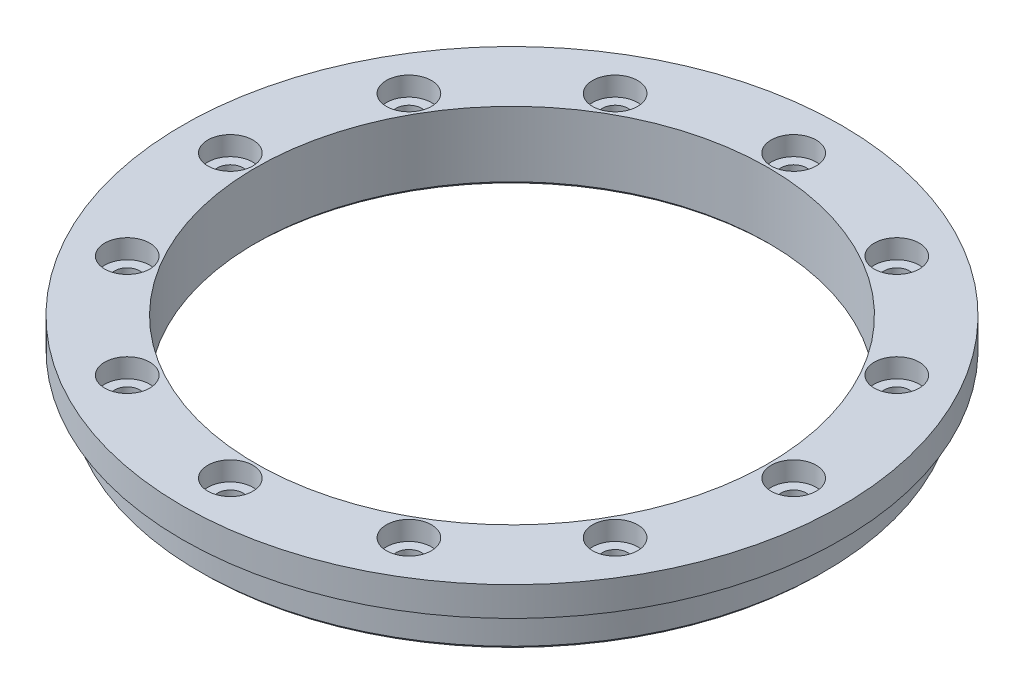
ISO-10303-21;
HEADER;
FILE_DESCRIPTION(('STEP AP214'),'2;1');
FILE_NAME('part.step','',(''),(''),'','','');
FILE_SCHEMA(('AUTOMOTIVE_DESIGN { 1 0 10303 214 1 1 1 1 }'));
ENDSEC;
DATA;
#1=APPLICATION_CONTEXT('core data for automotive mechanical design processes');
#2=APPLICATION_PROTOCOL_DEFINITION('international standard','automotive_design',2000,#1);
#3=PRODUCT_CONTEXT('',#1,'mechanical');
#4=PRODUCT('Part','Part','',(#3));
#5=PRODUCT_RELATED_PRODUCT_CATEGORY('part','',(#4));
#6=PRODUCT_DEFINITION_FORMATION('','',#4);
#7=PRODUCT_DEFINITION_CONTEXT('part definition',#1,'design');
#8=PRODUCT_DEFINITION('design','',#6,#7);
#9=PRODUCT_DEFINITION_SHAPE('','',#8);
#10=(LENGTH_UNIT() NAMED_UNIT(*) SI_UNIT(.MILLI.,.METRE.));
#11=(NAMED_UNIT(*) PLANE_ANGLE_UNIT() SI_UNIT($,.RADIAN.));
#12=(NAMED_UNIT(*) SI_UNIT($,.STERADIAN.) SOLID_ANGLE_UNIT());
#13=UNCERTAINTY_MEASURE_WITH_UNIT(LENGTH_MEASURE(1.E-05),#10,'distance_accuracy_value','');
#14=(GEOMETRIC_REPRESENTATION_CONTEXT(3) GLOBAL_UNCERTAINTY_ASSIGNED_CONTEXT((#13)) GLOBAL_UNIT_ASSIGNED_CONTEXT((#10,
#11,#12)) REPRESENTATION_CONTEXT('',''));
#15=CARTESIAN_POINT('',(0.,0.,0.));
#16=DIRECTION('',(0.,0.,1.));
#17=DIRECTION('',(1.,0.,0.));
#18=AXIS2_PLACEMENT_3D('',#15,#16,#17);
#19=CARTESIAN_POINT('',(0.,0.,0.));
#20=DIRECTION('',(0.,-1.,0.));
#21=DIRECTION('',(0.,0.,-1.));
#22=AXIS2_PLACEMENT_3D('',#19,#20,#21);
#23=CYLINDRICAL_SURFACE('',#22,55.5);
#24=CARTESIAN_POINT('',(0.,91.9,0.));
#25=DIRECTION('',(0.,-1.,0.));
#26=DIRECTION('',(0.,0.,-1.));
#27=AXIS2_PLACEMENT_3D('',#24,#25,#26);
#28=CIRCLE('',#27,55.5);
#29=CARTESIAN_POINT('',(0.,91.9,-55.5));
#30=VERTEX_POINT('',#29);
#31=EDGE_CURVE('E13',#30,#30,#28,.F.);
#32=ORIENTED_EDGE('',*,*,#31,.T.);
#33=EDGE_LOOP('',(#32));
#34=FACE_BOUND('',#33,.T.);
#35=CARTESIAN_POINT('',(0.,97.3,0.));
#36=DIRECTION('',(0.,1.,0.));
#37=DIRECTION('',(0.,0.,1.));
#38=AXIS2_PLACEMENT_3D('',#35,#36,#37);
#39=CIRCLE('',#38,55.5);
#40=CARTESIAN_POINT('',(0.,97.3,55.5));
#41=VERTEX_POINT('',#40);
#42=EDGE_CURVE('E282',#41,#41,#39,.T.);
#43=ORIENTED_EDGE('',*,*,#42,.F.);
#44=EDGE_LOOP('',(#43));
#45=FACE_BOUND('',#44,.T.);
#46=ADVANCED_FACE('F57',(#34,#45),#23,.T.);
#47=CARTESIAN_POINT('',(0.,91.3,-45.5));
#48=DIRECTION('',(0.,-1.,0.));
#49=DIRECTION('',(0.,0.,-1.));
#50=AXIS2_PLACEMENT_3D('',#47,#48,#49);
#51=PLANE('',#50);
#52=CARTESIAN_POINT('',(0.,91.3,0.));
#53=DIRECTION('',(0.,-1.,0.));
#54=DIRECTION('',(0.,0.,-1.));
#55=AXIS2_PLACEMENT_3D('',#52,#53,#54);
#56=CIRCLE('',#55,54.9);
#57=CARTESIAN_POINT('',(0.,91.3,-54.9));
#58=VERTEX_POINT('',#57);
#59=EDGE_CURVE('E66',#58,#58,#56,.T.);
#60=ORIENTED_EDGE('',*,*,#59,.T.);
#61=EDGE_LOOP('',(#60));
#62=FACE_BOUND('',#61,.T.);
#63=CARTESIAN_POINT('',(0.,91.3,0.));
#64=DIRECTION('',(0.,-1.,0.));
#65=DIRECTION('',(0.,0.,-1.));
#66=AXIS2_PLACEMENT_3D('',#63,#64,#65);
#67=CIRCLE('',#66,46.1);
#68=CARTESIAN_POINT('',(0.,91.3,-46.1));
#69=VERTEX_POINT('',#68);
#70=EDGE_CURVE('E72',#69,#69,#67,.F.);
#71=ORIENTED_EDGE('',*,*,#70,.T.);
#72=EDGE_LOOP('',(#71));
#73=FACE_BOUND('',#72,.T.);
#74=CARTESIAN_POINT('',(25.0000000000013,91.3,-43.3012701892212));
#75=DIRECTION('',(0.,-1.,0.));
#76=DIRECTION('',(0.,0.,-1.));
#77=AXIS2_PLACEMENT_3D('',#74,#75,#76);
#78=CIRCLE('',#77,2.25);
#79=CARTESIAN_POINT('',(25.0000000000013,91.3,-45.5512701892212));
#80=VERTEX_POINT('',#79);
#81=EDGE_CURVE('E151',#80,#80,#78,.F.);
#82=ORIENTED_EDGE('',*,*,#81,.T.);
#83=EDGE_LOOP('',(#82));
#84=FACE_BOUND('',#83,.T.);
#85=CARTESIAN_POINT('',(43.3012701892234,91.3,-24.9999999999974));
#86=DIRECTION('',(0.,-1.,0.));
#87=DIRECTION('',(0.,0.,-1.));
#88=AXIS2_PLACEMENT_3D('',#85,#86,#87);
#89=CIRCLE('',#88,2.25);
#90=CARTESIAN_POINT('',(43.3012701892234,91.3,-27.2499999999974));
#91=VERTEX_POINT('',#90);
#92=EDGE_CURVE('E145',#91,#91,#89,.F.);
#93=ORIENTED_EDGE('',*,*,#92,.T.);
#94=EDGE_LOOP('',(#93));
#95=FACE_BOUND('',#94,.T.);
#96=CARTESIAN_POINT('',(43.301270189219,91.3,25.0000000000052));
#97=DIRECTION('',(0.,-1.,0.));
#98=DIRECTION('',(0.,0.,-1.));
#99=AXIS2_PLACEMENT_3D('',#96,#97,#98);
#100=CIRCLE('',#99,2.25);
#101=CARTESIAN_POINT('',(43.301270189219,91.3,22.7500000000052));
#102=VERTEX_POINT('',#101);
#103=EDGE_CURVE('E139',#102,#102,#100,.F.);
#104=ORIENTED_EDGE('',*,*,#103,.T.);
#105=EDGE_LOOP('',(#104));
#106=FACE_BOUND('',#105,.T.);
#107=CARTESIAN_POINT('',(24.9999999999936,91.3,43.3012701892257));
#108=DIRECTION('',(0.,-1.,0.));
#109=DIRECTION('',(0.,0.,-1.));
#110=AXIS2_PLACEMENT_3D('',#107,#108,#109);
#111=CIRCLE('',#110,2.25);
#112=CARTESIAN_POINT('',(24.9999999999936,91.3,41.0512701892257));
#113=VERTEX_POINT('',#112);
#114=EDGE_CURVE('E133',#113,#113,#111,.F.);
#115=ORIENTED_EDGE('',*,*,#114,.T.);
#116=EDGE_LOOP('',(#115));
#117=FACE_BOUND('',#116,.T.);
#118=CARTESIAN_POINT('',(-8.94227434448302E-12,91.3,50.));
#119=DIRECTION('',(0.,-1.,0.));
#120=DIRECTION('',(0.,0.,-1.));
#121=AXIS2_PLACEMENT_3D('',#118,#119,#120);
#122=CIRCLE('',#121,2.25);
#123=CARTESIAN_POINT('',(-8.94227434448302E-12,91.3,47.75));
#124=VERTEX_POINT('',#123);
#125=EDGE_CURVE('E127',#124,#124,#122,.F.);
#126=ORIENTED_EDGE('',*,*,#125,.T.);
#127=EDGE_LOOP('',(#126));
#128=FACE_BOUND('',#127,.T.);
#129=CARTESIAN_POINT('',(-25.000000000009,91.3,43.3012701892167));
#130=DIRECTION('',(0.,-1.,0.));
#131=DIRECTION('',(0.,0.,-1.));
#132=AXIS2_PLACEMENT_3D('',#129,#130,#131);
#133=CIRCLE('',#132,2.25);
#134=CARTESIAN_POINT('',(-25.000000000009,91.3,41.0512701892167));
#135=VERTEX_POINT('',#134);
#136=EDGE_CURVE('E121',#135,#135,#133,.F.);
#137=ORIENTED_EDGE('',*,*,#136,.T.);
#138=EDGE_LOOP('',(#137));
#139=FACE_BOUND('',#138,.T.);
#140=CARTESIAN_POINT('',(-50.,91.3,-1.34023092864783E-11));
#141=DIRECTION('',(0.,-1.,0.));
#142=DIRECTION('',(0.,0.,-1.));
#143=AXIS2_PLACEMENT_3D('',#140,#141,#142);
#144=CIRCLE('',#143,2.25);
#145=CARTESIAN_POINT('',(-50.,91.3,-2.2500000000134));
#146=VERTEX_POINT('',#145);
#147=EDGE_CURVE('E115',#146,#146,#144,.F.);
#148=ORIENTED_EDGE('',*,*,#147,.T.);
#149=EDGE_LOOP('',(#148));
#150=FACE_BOUND('',#149,.T.);
#151=CARTESIAN_POINT('',(-24.9999999999858,91.3,-43.3012701892301));
#152=DIRECTION('',(0.,-1.,0.));
#153=DIRECTION('',(0.,0.,-1.));
#154=AXIS2_PLACEMENT_3D('',#151,#152,#153);
#155=CIRCLE('',#154,2.25);
#156=CARTESIAN_POINT('',(-24.9999999999858,91.3,-45.5512701892301));
#157=VERTEX_POINT('',#156);
#158=EDGE_CURVE('E109',#157,#157,#155,.F.);
#159=ORIENTED_EDGE('',*,*,#158,.T.);
#160=EDGE_LOOP('',(#159));
#161=FACE_BOUND('',#160,.T.);
#162=CARTESIAN_POINT('',(-43.3012701892145,91.3,-25.0000000000129));
#163=DIRECTION('',(0.,-1.,0.));
#164=DIRECTION('',(0.,0.,-1.));
#165=AXIS2_PLACEMENT_3D('',#162,#163,#164);
#166=CIRCLE('',#165,2.25);
#167=CARTESIAN_POINT('',(-43.3012701892145,91.3,-27.2500000000129));
#168=VERTEX_POINT('',#167);
#169=EDGE_CURVE('E103',#168,#168,#166,.F.);
#170=ORIENTED_EDGE('',*,*,#169,.T.);
#171=EDGE_LOOP('',(#170));
#172=FACE_BOUND('',#171,.T.);
#173=CARTESIAN_POINT('',(-43.3012701892279,91.3,24.9999999999897));
#174=DIRECTION('',(0.,-1.,0.));
#175=DIRECTION('',(0.,0.,-1.));
#176=AXIS2_PLACEMENT_3D('',#173,#174,#175);
#177=CIRCLE('',#176,2.25);
#178=CARTESIAN_POINT('',(-43.3012701892279,91.3,22.7499999999897));
#179=VERTEX_POINT('',#178);
#180=EDGE_CURVE('E97',#179,#179,#177,.F.);
#181=ORIENTED_EDGE('',*,*,#180,.T.);
#182=EDGE_LOOP('',(#181));
#183=FACE_BOUND('',#182,.T.);
#184=CARTESIAN_POINT('',(50.,91.3,4.47113717224151E-12));
#185=DIRECTION('',(0.,-1.,0.));
#186=DIRECTION('',(0.,0.,-1.));
#187=AXIS2_PLACEMENT_3D('',#184,#185,#186);
#188=CIRCLE('',#187,2.25);
#189=CARTESIAN_POINT('',(50.,91.3,-2.24999999999553));
#190=VERTEX_POINT('',#189);
#191=EDGE_CURVE('E91',#190,#190,#188,.F.);
#192=ORIENTED_EDGE('',*,*,#191,.T.);
#193=EDGE_LOOP('',(#192));
#194=FACE_BOUND('',#193,.T.);
#195=CARTESIAN_POINT('',(0.,91.3,-50.));
#196=DIRECTION('',(0.,-1.,0.));
#197=DIRECTION('',(0.,0.,-1.));
#198=AXIS2_PLACEMENT_3D('',#195,#196,#197);
#199=CIRCLE('',#198,2.25);
#200=CARTESIAN_POINT('',(0.,91.3,-52.25));
#201=VERTEX_POINT('',#200);
#202=EDGE_CURVE('E85',#201,#201,#199,.F.);
#203=ORIENTED_EDGE('',*,*,#202,.T.);
#204=EDGE_LOOP('',(#203));
#205=FACE_BOUND('',#204,.T.);
#206=ADVANCED_FACE('F319',(#62,#73,#84,#95,#106,#117,#128,#139,#150,#161,#172,#183,#194,#205),
#51,.T.);
#207=CARTESIAN_POINT('',(0.,0.,0.));
#208=DIRECTION('',(0.,-1.,0.));
#209=DIRECTION('',(0.,0.,-1.));
#210=AXIS2_PLACEMENT_3D('',#207,#208,#209);
#211=CYLINDRICAL_SURFACE('',#210,45.5);
#212=CARTESIAN_POINT('',(0.,91.9,0.));
#213=DIRECTION('',(0.,-1.,0.));
#214=DIRECTION('',(0.,0.,-1.));
#215=AXIS2_PLACEMENT_3D('',#212,#213,#214);
#216=CIRCLE('',#215,45.5);
#217=CARTESIAN_POINT('',(0.,91.9,-45.5));
#218=VERTEX_POINT('',#217);
#219=EDGE_CURVE('E78',#218,#218,#216,.T.);
#220=ORIENTED_EDGE('',*,*,#219,.T.);
#221=EDGE_LOOP('',(#220));
#222=FACE_BOUND('',#221,.T.);
#223=CARTESIAN_POINT('',(0.,103.5,0.));
#224=DIRECTION('',(0.,-1.,0.));
#225=DIRECTION('',(0.,0.,-1.));
#226=AXIS2_PLACEMENT_3D('',#223,#224,#225);
#227=CIRCLE('',#226,45.5);
#228=CARTESIAN_POINT('',(0.,103.5,-45.5));
#229=VERTEX_POINT('',#228);
#230=EDGE_CURVE('E164',#229,#229,#227,.T.);
#231=ORIENTED_EDGE('',*,*,#230,.F.);
#232=EDGE_LOOP('',(#231));
#233=FACE_BOUND('',#232,.T.);
#234=ADVANCED_FACE('F327',(#222,#233),#211,.F.);
#235=CARTESIAN_POINT('',(0.,98.3,-55.5));
#236=DIRECTION('',(0.,-1.,0.));
#237=DIRECTION('',(0.,0.,-1.));
#238=AXIS2_PLACEMENT_3D('',#235,#236,#237);
#239=PLANE('',#238);
#240=CARTESIAN_POINT('',(0.,98.3,0.));
#241=DIRECTION('',(0.,-1.,0.));
#242=DIRECTION('',(0.,0.,-1.));
#243=AXIS2_PLACEMENT_3D('',#240,#241,#242);
#244=CIRCLE('',#243,58.5);
#245=CARTESIAN_POINT('',(0.,98.3,-58.5));
#246=VERTEX_POINT('',#245);
#247=EDGE_CURVE('E84',#246,#246,#244,.T.);
#248=ORIENTED_EDGE('',*,*,#247,.T.);
#249=EDGE_LOOP('',(#248));
#250=FACE_BOUND('',#249,.T.);
#251=CARTESIAN_POINT('',(0.,98.3,0.));
#252=DIRECTION('',(0.,1.,0.));
#253=DIRECTION('',(0.,0.,1.));
#254=AXIS2_PLACEMENT_3D('',#251,#252,#253);
#255=CIRCLE('',#254,54.5);
#256=CARTESIAN_POINT('',(0.,98.3,54.5));
#257=VERTEX_POINT('',#256);
#258=EDGE_CURVE('E296',#257,#257,#255,.T.);
#259=ORIENTED_EDGE('',*,*,#258,.T.);
#260=EDGE_LOOP('',(#259));
#261=FACE_BOUND('',#260,.T.);
#262=ADVANCED_FACE('F302',(#250,#261),#239,.T.);
#263=CARTESIAN_POINT('',(0.,0.,0.));
#264=DIRECTION('',(0.,-1.,0.));
#265=DIRECTION('',(0.,0.,-1.));
#266=AXIS2_PLACEMENT_3D('',#263,#264,#265);
#267=CYLINDRICAL_SURFACE('',#266,58.5);
#268=CARTESIAN_POINT('',(0.,103.5,0.));
#269=DIRECTION('',(0.,-1.,0.));
#270=DIRECTION('',(0.,0.,-1.));
#271=AXIS2_PLACEMENT_3D('',#268,#269,#270);
#272=CIRCLE('',#271,58.5);
#273=CARTESIAN_POINT('',(0.,103.5,-58.5));
#274=VERTEX_POINT('',#273);
#275=EDGE_CURVE('E160',#274,#274,#272,.T.);
#276=ORIENTED_EDGE('',*,*,#275,.T.);
#277=EDGE_LOOP('',(#276));
#278=FACE_BOUND('',#277,.T.);
#279=ORIENTED_EDGE('',*,*,#247,.F.);
#280=EDGE_LOOP('',(#279));
#281=FACE_BOUND('',#280,.T.);
#282=ADVANCED_FACE('F343',(#278,#281),#267,.T.);
#283=CARTESIAN_POINT('',(0.,103.5,-58.5));
#284=DIRECTION('',(0.,1.,0.));
#285=DIRECTION('',(0.,0.,1.));
#286=AXIS2_PLACEMENT_3D('',#283,#284,#285);
#287=PLANE('',#286);
#288=CARTESIAN_POINT('',(0.,103.5,-50.));
#289=DIRECTION('',(0.,1.,0.));
#290=DIRECTION('',(0.,0.,1.));
#291=AXIS2_PLACEMENT_3D('',#288,#289,#290);
#292=CIRCLE('',#291,4.);
#293=CARTESIAN_POINT('',(0.,103.5,-46.));
#294=VERTEX_POINT('',#293);
#295=EDGE_CURVE('E90',#294,#294,#292,.T.);
#296=ORIENTED_EDGE('',*,*,#295,.F.);
#297=EDGE_LOOP('',(#296));
#298=FACE_BOUND('',#297,.T.);
#299=CARTESIAN_POINT('',(25.0000000000013,103.5,-43.3012701892212));
#300=DIRECTION('',(0.,1.,0.));
#301=DIRECTION('',(0.,0.,1.));
#302=AXIS2_PLACEMENT_3D('',#299,#300,#301);
#303=CIRCLE('',#302,4.);
#304=CARTESIAN_POINT('',(25.0000000000013,103.5,-39.3012701892212));
#305=VERTEX_POINT('',#304);
#306=EDGE_CURVE('E156',#305,#305,#303,.T.);
#307=ORIENTED_EDGE('',*,*,#306,.F.);
#308=EDGE_LOOP('',(#307));
#309=FACE_BOUND('',#308,.T.);
#310=CARTESIAN_POINT('',(43.3012701892234,103.5,-24.9999999999974));
#311=DIRECTION('',(0.,1.,0.));
#312=DIRECTION('',(0.,0.,1.));
#313=AXIS2_PLACEMENT_3D('',#310,#311,#312);
#314=CIRCLE('',#313,4.);
#315=CARTESIAN_POINT('',(43.3012701892234,103.5,-20.9999999999974));
#316=VERTEX_POINT('',#315);
#317=EDGE_CURVE('E150',#316,#316,#314,.T.);
#318=ORIENTED_EDGE('',*,*,#317,.F.);
#319=EDGE_LOOP('',(#318));
#320=FACE_BOUND('',#319,.T.);
#321=CARTESIAN_POINT('',(50.,103.5,4.47113717224151E-12));
#322=DIRECTION('',(0.,1.,0.));
#323=DIRECTION('',(0.,0.,1.));
#324=AXIS2_PLACEMENT_3D('',#321,#322,#323);
#325=CIRCLE('',#324,4.);
#326=CARTESIAN_POINT('',(50.,103.5,4.00000000000447));
#327=VERTEX_POINT('',#326);
#328=EDGE_CURVE('E96',#327,#327,#325,.T.);
#329=ORIENTED_EDGE('',*,*,#328,.F.);
#330=EDGE_LOOP('',(#329));
#331=FACE_BOUND('',#330,.T.);
#332=CARTESIAN_POINT('',(43.301270189219,103.5,25.0000000000052));
#333=DIRECTION('',(0.,1.,0.));
#334=DIRECTION('',(0.,0.,1.));
#335=AXIS2_PLACEMENT_3D('',#332,#333,#334);
#336=CIRCLE('',#335,4.);
#337=CARTESIAN_POINT('',(43.301270189219,103.5,29.0000000000052));
#338=VERTEX_POINT('',#337);
#339=EDGE_CURVE('E144',#338,#338,#336,.T.);
#340=ORIENTED_EDGE('',*,*,#339,.F.);
#341=EDGE_LOOP('',(#340));
#342=FACE_BOUND('',#341,.T.);
#343=CARTESIAN_POINT('',(24.9999999999936,103.5,43.3012701892257));
#344=DIRECTION('',(0.,1.,0.));
#345=DIRECTION('',(0.,0.,1.));
#346=AXIS2_PLACEMENT_3D('',#343,#344,#345);
#347=CIRCLE('',#346,4.);
#348=CARTESIAN_POINT('',(24.9999999999936,103.5,47.3012701892257));
#349=VERTEX_POINT('',#348);
#350=EDGE_CURVE('E138',#349,#349,#347,.T.);
#351=ORIENTED_EDGE('',*,*,#350,.F.);
#352=EDGE_LOOP('',(#351));
#353=FACE_BOUND('',#352,.T.);
#354=CARTESIAN_POINT('',(-8.94227434448302E-12,103.5,50.));
#355=DIRECTION('',(0.,1.,0.));
#356=DIRECTION('',(0.,0.,1.));
#357=AXIS2_PLACEMENT_3D('',#354,#355,#356);
#358=CIRCLE('',#357,4.);
#359=CARTESIAN_POINT('',(-8.94227434448302E-12,103.5,54.));
#360=VERTEX_POINT('',#359);
#361=EDGE_CURVE('E132',#360,#360,#358,.T.);
#362=ORIENTED_EDGE('',*,*,#361,.F.);
#363=EDGE_LOOP('',(#362));
#364=FACE_BOUND('',#363,.T.);
#365=CARTESIAN_POINT('',(-25.000000000009,103.5,43.3012701892167));
#366=DIRECTION('',(0.,1.,0.));
#367=DIRECTION('',(0.,0.,1.));
#368=AXIS2_PLACEMENT_3D('',#365,#366,#367);
#369=CIRCLE('',#368,4.);
#370=CARTESIAN_POINT('',(-25.000000000009,103.5,47.3012701892167));
#371=VERTEX_POINT('',#370);
#372=EDGE_CURVE('E126',#371,#371,#369,.T.);
#373=ORIENTED_EDGE('',*,*,#372,.F.);
#374=EDGE_LOOP('',(#373));
#375=FACE_BOUND('',#374,.T.);
#376=CARTESIAN_POINT('',(-43.3012701892279,103.5,24.9999999999897));
#377=DIRECTION('',(0.,1.,0.));
#378=DIRECTION('',(0.,0.,1.));
#379=AXIS2_PLACEMENT_3D('',#376,#377,#378);
#380=CIRCLE('',#379,4.);
#381=CARTESIAN_POINT('',(-43.3012701892279,103.5,28.9999999999897));
#382=VERTEX_POINT('',#381);
#383=EDGE_CURVE('E102',#382,#382,#380,.T.);
#384=ORIENTED_EDGE('',*,*,#383,.F.);
#385=EDGE_LOOP('',(#384));
#386=FACE_BOUND('',#385,.T.);
#387=CARTESIAN_POINT('',(-50.,103.5,-1.34023092864783E-11));
#388=DIRECTION('',(0.,1.,0.));
#389=DIRECTION('',(0.,0.,1.));
#390=AXIS2_PLACEMENT_3D('',#387,#388,#389);
#391=CIRCLE('',#390,4.);
#392=CARTESIAN_POINT('',(-50.,103.5,3.9999999999866));
#393=VERTEX_POINT('',#392);
#394=EDGE_CURVE('E120',#393,#393,#391,.T.);
#395=ORIENTED_EDGE('',*,*,#394,.F.);
#396=EDGE_LOOP('',(#395));
#397=FACE_BOUND('',#396,.T.);
#398=CARTESIAN_POINT('',(-43.3012701892145,103.5,-25.0000000000129));
#399=DIRECTION('',(0.,1.,0.));
#400=DIRECTION('',(0.,0.,1.));
#401=AXIS2_PLACEMENT_3D('',#398,#399,#400);
#402=CIRCLE('',#401,4.);
#403=CARTESIAN_POINT('',(-43.3012701892145,103.5,-21.0000000000129));
#404=VERTEX_POINT('',#403);
#405=EDGE_CURVE('E108',#404,#404,#402,.T.);
#406=ORIENTED_EDGE('',*,*,#405,.F.);
#407=EDGE_LOOP('',(#406));
#408=FACE_BOUND('',#407,.T.);
#409=CARTESIAN_POINT('',(-24.9999999999858,103.5,-43.3012701892301));
#410=DIRECTION('',(0.,1.,0.));
#411=DIRECTION('',(0.,0.,1.));
#412=AXIS2_PLACEMENT_3D('',#409,#410,#411);
#413=CIRCLE('',#412,4.);
#414=CARTESIAN_POINT('',(-24.9999999999858,103.5,-39.3012701892301));
#415=VERTEX_POINT('',#414);
#416=EDGE_CURVE('E114',#415,#415,#413,.T.);
#417=ORIENTED_EDGE('',*,*,#416,.F.);
#418=EDGE_LOOP('',(#417));
#419=FACE_BOUND('',#418,.T.);
#420=ORIENTED_EDGE('',*,*,#230,.T.);
#421=EDGE_LOOP('',(#420));
#422=FACE_BOUND('',#421,.T.);
#423=ORIENTED_EDGE('',*,*,#275,.F.);
#424=EDGE_LOOP('',(#423));
#425=FACE_BOUND('',#424,.T.);
#426=ADVANCED_FACE('F349',(#298,#309,#320,#331,#342,#353,#364,#375,#386,#397,#408,#419,#422,
#425),#287,.T.);
#427=CARTESIAN_POINT('',(-24.9999999999858,103.5,-43.3012701892301));
#428=DIRECTION('',(0.,1.,0.));
#429=DIRECTION('',(0.,0.,1.));
#430=AXIS2_PLACEMENT_3D('',#427,#428,#429);
#431=CYLINDRICAL_SURFACE('',#430,2.25);
#432=ORIENTED_EDGE('',*,*,#158,.F.);
#433=EDGE_LOOP('',(#432));
#434=FACE_BOUND('',#433,.T.);
#435=CARTESIAN_POINT('',(-24.9999999999858,100.1,-43.3012701892301));
#436=DIRECTION('',(0.,1.,0.));
#437=DIRECTION('',(0.,0.,1.));
#438=AXIS2_PLACEMENT_3D('',#435,#436,#437);
#439=CIRCLE('',#438,2.25);
#440=CARTESIAN_POINT('',(-24.9999999999858,100.1,-41.0512701892301));
#441=VERTEX_POINT('',#440);
#442=EDGE_CURVE('E113',#441,#441,#439,.T.);
#443=ORIENTED_EDGE('',*,*,#442,.T.);
#444=EDGE_LOOP('',(#443));
#445=FACE_BOUND('',#444,.T.);
#446=ADVANCED_FACE('F352',(#434,#445),#431,.F.);
#447=CARTESIAN_POINT('',(-22.7499999999858,100.1,-43.3012701892301));
#448=DIRECTION('',(0.,-1.,0.));
#449=DIRECTION('',(0.,0.,-1.));
#450=AXIS2_PLACEMENT_3D('',#447,#448,#449);
#451=PLANE('',#450);
#452=ORIENTED_EDGE('',*,*,#442,.F.);
#453=EDGE_LOOP('',(#452));
#454=FACE_BOUND('',#453,.T.);
#455=CARTESIAN_POINT('',(-24.9999999999858,100.1,-43.3012701892301));
#456=DIRECTION('',(0.,1.,0.));
#457=DIRECTION('',(0.,0.,1.));
#458=AXIS2_PLACEMENT_3D('',#455,#456,#457);
#459=CIRCLE('',#458,4.);
#460=CARTESIAN_POINT('',(-24.9999999999858,100.1,-39.3012701892301));
#461=VERTEX_POINT('',#460);
#462=EDGE_CURVE('E168',#461,#461,#459,.T.);
#463=ORIENTED_EDGE('',*,*,#462,.T.);
#464=EDGE_LOOP('',(#463));
#465=FACE_BOUND('',#464,.T.);
#466=ADVANCED_FACE('F367',(#454,#465),#451,.F.);
#467=CARTESIAN_POINT('',(-24.9999999999858,103.5,-43.3012701892301));
#468=DIRECTION('',(0.,1.,0.));
#469=DIRECTION('',(0.,0.,1.));
#470=AXIS2_PLACEMENT_3D('',#467,#468,#469);
#471=CYLINDRICAL_SURFACE('',#470,4.);
#472=ORIENTED_EDGE('',*,*,#462,.F.);
#473=EDGE_LOOP('',(#472));
#474=FACE_BOUND('',#473,.T.);
#475=ORIENTED_EDGE('',*,*,#416,.T.);
#476=EDGE_LOOP('',(#475));
#477=FACE_BOUND('',#476,.T.);
#478=ADVANCED_FACE('F364',(#474,#477),#471,.F.);
#479=CARTESIAN_POINT('',(-43.3012701892145,103.5,-25.0000000000129));
#480=DIRECTION('',(0.,1.,0.));
#481=DIRECTION('',(0.,0.,1.));
#482=AXIS2_PLACEMENT_3D('',#479,#480,#481);
#483=CYLINDRICAL_SURFACE('',#482,2.25);
#484=ORIENTED_EDGE('',*,*,#169,.F.);
#485=EDGE_LOOP('',(#484));
#486=FACE_BOUND('',#485,.T.);
#487=CARTESIAN_POINT('',(-43.3012701892145,100.1,-25.0000000000129));
#488=DIRECTION('',(0.,1.,0.));
#489=DIRECTION('',(0.,0.,1.));
#490=AXIS2_PLACEMENT_3D('',#487,#488,#489);
#491=CIRCLE('',#490,2.25);
#492=CARTESIAN_POINT('',(-43.3012701892145,100.1,-22.7500000000129));
#493=VERTEX_POINT('',#492);
#494=EDGE_CURVE('E107',#493,#493,#491,.T.);
#495=ORIENTED_EDGE('',*,*,#494,.T.);
#496=EDGE_LOOP('',(#495));
#497=FACE_BOUND('',#496,.T.);
#498=ADVANCED_FACE('F366',(#486,#497),#483,.F.);
#499=CARTESIAN_POINT('',(-41.0512701892145,100.1,-25.0000000000129));
#500=DIRECTION('',(0.,-1.,0.));
#501=DIRECTION('',(0.,0.,-1.));
#502=AXIS2_PLACEMENT_3D('',#499,#500,#501);
#503=PLANE('',#502);
#504=ORIENTED_EDGE('',*,*,#494,.F.);
#505=EDGE_LOOP('',(#504));
#506=FACE_BOUND('',#505,.T.);
#507=CARTESIAN_POINT('',(-43.3012701892145,100.1,-25.0000000000129));
#508=DIRECTION('',(0.,1.,0.));
#509=DIRECTION('',(0.,0.,1.));
#510=AXIS2_PLACEMENT_3D('',#507,#508,#509);
#511=CIRCLE('',#510,4.);
#512=CARTESIAN_POINT('',(-43.3012701892145,100.1,-21.0000000000129));
#513=VERTEX_POINT('',#512);
#514=EDGE_CURVE('E172',#513,#513,#511,.T.);
#515=ORIENTED_EDGE('',*,*,#514,.T.);
#516=EDGE_LOOP('',(#515));
#517=FACE_BOUND('',#516,.T.);
#518=ADVANCED_FACE('F379',(#506,#517),#503,.F.);
#519=CARTESIAN_POINT('',(-43.3012701892145,103.5,-25.0000000000129));
#520=DIRECTION('',(0.,1.,0.));
#521=DIRECTION('',(0.,0.,1.));
#522=AXIS2_PLACEMENT_3D('',#519,#520,#521);
#523=CYLINDRICAL_SURFACE('',#522,4.);
#524=ORIENTED_EDGE('',*,*,#514,.F.);
#525=EDGE_LOOP('',(#524));
#526=FACE_BOUND('',#525,.T.);
#527=ORIENTED_EDGE('',*,*,#405,.T.);
#528=EDGE_LOOP('',(#527));
#529=FACE_BOUND('',#528,.T.);
#530=ADVANCED_FACE('F375',(#526,#529),#523,.F.);
#531=CARTESIAN_POINT('',(-50.,103.5,-1.34023092864783E-11));
#532=DIRECTION('',(0.,1.,0.));
#533=DIRECTION('',(0.,0.,1.));
#534=AXIS2_PLACEMENT_3D('',#531,#532,#533);
#535=CYLINDRICAL_SURFACE('',#534,2.25);
#536=ORIENTED_EDGE('',*,*,#147,.F.);
#537=EDGE_LOOP('',(#536));
#538=FACE_BOUND('',#537,.T.);
#539=CARTESIAN_POINT('',(-50.,100.1,-1.34023092864783E-11));
#540=DIRECTION('',(0.,1.,0.));
#541=DIRECTION('',(0.,0.,1.));
#542=AXIS2_PLACEMENT_3D('',#539,#540,#541);
#543=CIRCLE('',#542,2.25);
#544=CARTESIAN_POINT('',(-50.,100.1,2.2499999999866));
#545=VERTEX_POINT('',#544);
#546=EDGE_CURVE('E119',#545,#545,#543,.T.);
#547=ORIENTED_EDGE('',*,*,#546,.T.);
#548=EDGE_LOOP('',(#547));
#549=FACE_BOUND('',#548,.T.);
#550=ADVANCED_FACE('F378',(#538,#549),#535,.F.);
#551=CARTESIAN_POINT('',(-47.75,100.1,-1.34023092864783E-11));
#552=DIRECTION('',(0.,-1.,0.));
#553=DIRECTION('',(0.,0.,-1.));
#554=AXIS2_PLACEMENT_3D('',#551,#552,#553);
#555=PLANE('',#554);
#556=ORIENTED_EDGE('',*,*,#546,.F.);
#557=EDGE_LOOP('',(#556));
#558=FACE_BOUND('',#557,.T.);
#559=CARTESIAN_POINT('',(-50.,100.1,-1.34023092864783E-11));
#560=DIRECTION('',(0.,1.,0.));
#561=DIRECTION('',(0.,0.,1.));
#562=AXIS2_PLACEMENT_3D('',#559,#560,#561);
#563=CIRCLE('',#562,4.);
#564=CARTESIAN_POINT('',(-50.,100.1,3.99999999998659));
#565=VERTEX_POINT('',#564);
#566=EDGE_CURVE('E182',#565,#565,#563,.T.);
#567=ORIENTED_EDGE('',*,*,#566,.T.);
#568=EDGE_LOOP('',(#567));
#569=FACE_BOUND('',#568,.T.);
#570=ADVANCED_FACE('F391',(#558,#569),#555,.F.);
#571=CARTESIAN_POINT('',(-50.,103.5,-1.34023092864783E-11));
#572=DIRECTION('',(0.,1.,0.));
#573=DIRECTION('',(0.,0.,1.));
#574=AXIS2_PLACEMENT_3D('',#571,#572,#573);
#575=CYLINDRICAL_SURFACE('',#574,4.);
#576=ORIENTED_EDGE('',*,*,#566,.F.);
#577=EDGE_LOOP('',(#576));
#578=FACE_BOUND('',#577,.T.);
#579=ORIENTED_EDGE('',*,*,#394,.T.);
#580=EDGE_LOOP('',(#579));
#581=FACE_BOUND('',#580,.T.);
#582=ADVANCED_FACE('F387',(#578,#581),#575,.F.);
#583=CARTESIAN_POINT('',(-43.3012701892279,103.5,24.9999999999897));
#584=DIRECTION('',(0.,1.,0.));
#585=DIRECTION('',(0.,0.,1.));
#586=AXIS2_PLACEMENT_3D('',#583,#584,#585);
#587=CYLINDRICAL_SURFACE('',#586,2.25);
#588=ORIENTED_EDGE('',*,*,#180,.F.);
#589=EDGE_LOOP('',(#588));
#590=FACE_BOUND('',#589,.T.);
#591=CARTESIAN_POINT('',(-43.3012701892279,100.1,24.9999999999897));
#592=DIRECTION('',(0.,1.,0.));
#593=DIRECTION('',(0.,0.,1.));
#594=AXIS2_PLACEMENT_3D('',#591,#592,#593);
#595=CIRCLE('',#594,2.25);
#596=CARTESIAN_POINT('',(-43.3012701892279,100.1,27.2499999999897));
#597=VERTEX_POINT('',#596);
#598=EDGE_CURVE('E101',#597,#597,#595,.T.);
#599=ORIENTED_EDGE('',*,*,#598,.T.);
#600=EDGE_LOOP('',(#599));
#601=FACE_BOUND('',#600,.T.);
#602=ADVANCED_FACE('F390',(#590,#601),#587,.F.);
#603=CARTESIAN_POINT('',(-41.0512701892279,100.1,24.9999999999897));
#604=DIRECTION('',(0.,-1.,0.));
#605=DIRECTION('',(0.,0.,-1.));
#606=AXIS2_PLACEMENT_3D('',#603,#604,#605);
#607=PLANE('',#606);
#608=ORIENTED_EDGE('',*,*,#598,.F.);
#609=EDGE_LOOP('',(#608));
#610=FACE_BOUND('',#609,.T.);
#611=CARTESIAN_POINT('',(-43.3012701892279,100.1,24.9999999999897));
#612=DIRECTION('',(0.,1.,0.));
#613=DIRECTION('',(0.,0.,1.));
#614=AXIS2_PLACEMENT_3D('',#611,#612,#613);
#615=CIRCLE('',#614,4.);
#616=CARTESIAN_POINT('',(-43.3012701892279,100.1,28.9999999999897));
#617=VERTEX_POINT('',#616);
#618=EDGE_CURVE('E192',#617,#617,#615,.T.);
#619=ORIENTED_EDGE('',*,*,#618,.T.);
#620=EDGE_LOOP('',(#619));
#621=FACE_BOUND('',#620,.T.);
#622=ADVANCED_FACE('F403',(#610,#621),#607,.F.);
#623=CARTESIAN_POINT('',(-43.3012701892279,103.5,24.9999999999897));
#624=DIRECTION('',(0.,1.,0.));
#625=DIRECTION('',(0.,0.,1.));
#626=AXIS2_PLACEMENT_3D('',#623,#624,#625);
#627=CYLINDRICAL_SURFACE('',#626,4.);
#628=ORIENTED_EDGE('',*,*,#618,.F.);
#629=EDGE_LOOP('',(#628));
#630=FACE_BOUND('',#629,.T.);
#631=ORIENTED_EDGE('',*,*,#383,.T.);
#632=EDGE_LOOP('',(#631));
#633=FACE_BOUND('',#632,.T.);
#634=ADVANCED_FACE('F399',(#630,#633),#627,.F.);
#635=CARTESIAN_POINT('',(-25.000000000009,103.5,43.3012701892167));
#636=DIRECTION('',(0.,1.,0.));
#637=DIRECTION('',(0.,0.,1.));
#638=AXIS2_PLACEMENT_3D('',#635,#636,#637);
#639=CYLINDRICAL_SURFACE('',#638,2.25);
#640=ORIENTED_EDGE('',*,*,#136,.F.);
#641=EDGE_LOOP('',(#640));
#642=FACE_BOUND('',#641,.T.);
#643=CARTESIAN_POINT('',(-25.000000000009,100.1,43.3012701892167));
#644=DIRECTION('',(0.,1.,0.));
#645=DIRECTION('',(0.,0.,1.));
#646=AXIS2_PLACEMENT_3D('',#643,#644,#645);
#647=CIRCLE('',#646,2.25);
#648=CARTESIAN_POINT('',(-25.000000000009,100.1,45.5512701892167));
#649=VERTEX_POINT('',#648);
#650=EDGE_CURVE('E125',#649,#649,#647,.T.);
#651=ORIENTED_EDGE('',*,*,#650,.T.);
#652=EDGE_LOOP('',(#651));
#653=FACE_BOUND('',#652,.T.);
#654=ADVANCED_FACE('F402',(#642,#653),#639,.F.);
#655=CARTESIAN_POINT('',(-22.750000000009,100.1,43.3012701892167));
#656=DIRECTION('',(0.,-1.,0.));
#657=DIRECTION('',(0.,0.,-1.));
#658=AXIS2_PLACEMENT_3D('',#655,#656,#657);
#659=PLANE('',#658);
#660=ORIENTED_EDGE('',*,*,#650,.F.);
#661=EDGE_LOOP('',(#660));
#662=FACE_BOUND('',#661,.T.);
#663=CARTESIAN_POINT('',(-25.000000000009,100.1,43.3012701892167));
#664=DIRECTION('',(0.,1.,0.));
#665=DIRECTION('',(0.,0.,1.));
#666=AXIS2_PLACEMENT_3D('',#663,#664,#665);
#667=CIRCLE('',#666,4.);
#668=CARTESIAN_POINT('',(-25.000000000009,100.1,47.3012701892167));
#669=VERTEX_POINT('',#668);
#670=EDGE_CURVE('E202',#669,#669,#667,.T.);
#671=ORIENTED_EDGE('',*,*,#670,.T.);
#672=EDGE_LOOP('',(#671));
#673=FACE_BOUND('',#672,.T.);
#674=ADVANCED_FACE('F415',(#662,#673),#659,.F.);
#675=CARTESIAN_POINT('',(-25.000000000009,103.5,43.3012701892167));
#676=DIRECTION('',(0.,1.,0.));
#677=DIRECTION('',(0.,0.,1.));
#678=AXIS2_PLACEMENT_3D('',#675,#676,#677);
#679=CYLINDRICAL_SURFACE('',#678,4.);
#680=ORIENTED_EDGE('',*,*,#670,.F.);
#681=EDGE_LOOP('',(#680));
#682=FACE_BOUND('',#681,.T.);
#683=ORIENTED_EDGE('',*,*,#372,.T.);
#684=EDGE_LOOP('',(#683));
#685=FACE_BOUND('',#684,.T.);
#686=ADVANCED_FACE('F411',(#682,#685),#679,.F.);
#687=CARTESIAN_POINT('',(-8.94227434448302E-12,103.5,50.));
#688=DIRECTION('',(0.,1.,0.));
#689=DIRECTION('',(0.,0.,1.));
#690=AXIS2_PLACEMENT_3D('',#687,#688,#689);
#691=CYLINDRICAL_SURFACE('',#690,2.25);
#692=ORIENTED_EDGE('',*,*,#125,.F.);
#693=EDGE_LOOP('',(#692));
#694=FACE_BOUND('',#693,.T.);
#695=CARTESIAN_POINT('',(-8.94227434448302E-12,100.1,50.));
#696=DIRECTION('',(0.,1.,0.));
#697=DIRECTION('',(0.,0.,1.));
#698=AXIS2_PLACEMENT_3D('',#695,#696,#697);
#699=CIRCLE('',#698,2.25);
#700=CARTESIAN_POINT('',(-8.94227434448302E-12,100.1,52.25));
#701=VERTEX_POINT('',#700);
#702=EDGE_CURVE('E131',#701,#701,#699,.T.);
#703=ORIENTED_EDGE('',*,*,#702,.T.);
#704=EDGE_LOOP('',(#703));
#705=FACE_BOUND('',#704,.T.);
#706=ADVANCED_FACE('F414',(#694,#705),#691,.F.);
#707=CARTESIAN_POINT('',(2.24999999999106,100.1,50.));
#708=DIRECTION('',(0.,-1.,0.));
#709=DIRECTION('',(0.,0.,-1.));
#710=AXIS2_PLACEMENT_3D('',#707,#708,#709);
#711=PLANE('',#710);
#712=ORIENTED_EDGE('',*,*,#702,.F.);
#713=EDGE_LOOP('',(#712));
#714=FACE_BOUND('',#713,.T.);
#715=CARTESIAN_POINT('',(-8.94227434448302E-12,100.1,50.));
#716=DIRECTION('',(0.,1.,0.));
#717=DIRECTION('',(0.,0.,1.));
#718=AXIS2_PLACEMENT_3D('',#715,#716,#717);
#719=CIRCLE('',#718,4.);
#720=CARTESIAN_POINT('',(-8.94227434448302E-12,100.1,54.));
#721=VERTEX_POINT('',#720);
#722=EDGE_CURVE('E212',#721,#721,#719,.T.);
#723=ORIENTED_EDGE('',*,*,#722,.T.);
#724=EDGE_LOOP('',(#723));
#725=FACE_BOUND('',#724,.T.);
#726=ADVANCED_FACE('F427',(#714,#725),#711,.F.);
#727=CARTESIAN_POINT('',(-8.94227434448302E-12,103.5,50.));
#728=DIRECTION('',(0.,1.,0.));
#729=DIRECTION('',(0.,0.,1.));
#730=AXIS2_PLACEMENT_3D('',#727,#728,#729);
#731=CYLINDRICAL_SURFACE('',#730,4.);
#732=ORIENTED_EDGE('',*,*,#722,.F.);
#733=EDGE_LOOP('',(#732));
#734=FACE_BOUND('',#733,.T.);
#735=ORIENTED_EDGE('',*,*,#361,.T.);
#736=EDGE_LOOP('',(#735));
#737=FACE_BOUND('',#736,.T.);
#738=ADVANCED_FACE('F423',(#734,#737),#731,.F.);
#739=CARTESIAN_POINT('',(24.9999999999936,103.5,43.3012701892257));
#740=DIRECTION('',(0.,1.,0.));
#741=DIRECTION('',(0.,0.,1.));
#742=AXIS2_PLACEMENT_3D('',#739,#740,#741);
#743=CYLINDRICAL_SURFACE('',#742,2.25);
#744=ORIENTED_EDGE('',*,*,#114,.F.);
#745=EDGE_LOOP('',(#744));
#746=FACE_BOUND('',#745,.T.);
#747=CARTESIAN_POINT('',(24.9999999999936,100.1,43.3012701892257));
#748=DIRECTION('',(0.,1.,0.));
#749=DIRECTION('',(0.,0.,1.));
#750=AXIS2_PLACEMENT_3D('',#747,#748,#749);
#751=CIRCLE('',#750,2.25);
#752=CARTESIAN_POINT('',(24.9999999999936,100.1,45.5512701892257));
#753=VERTEX_POINT('',#752);
#754=EDGE_CURVE('E137',#753,#753,#751,.T.);
#755=ORIENTED_EDGE('',*,*,#754,.T.);
#756=EDGE_LOOP('',(#755));
#757=FACE_BOUND('',#756,.T.);
#758=ADVANCED_FACE('F426',(#746,#757),#743,.F.);
#759=CARTESIAN_POINT('',(27.2499999999936,100.1,43.3012701892257));
#760=DIRECTION('',(0.,-1.,0.));
#761=DIRECTION('',(0.,0.,-1.));
#762=AXIS2_PLACEMENT_3D('',#759,#760,#761);
#763=PLANE('',#762);
#764=ORIENTED_EDGE('',*,*,#754,.F.);
#765=EDGE_LOOP('',(#764));
#766=FACE_BOUND('',#765,.T.);
#767=CARTESIAN_POINT('',(24.9999999999936,100.1,43.3012701892257));
#768=DIRECTION('',(0.,1.,0.));
#769=DIRECTION('',(0.,0.,1.));
#770=AXIS2_PLACEMENT_3D('',#767,#768,#769);
#771=CIRCLE('',#770,4.);
#772=CARTESIAN_POINT('',(24.9999999999936,100.1,47.3012701892257));
#773=VERTEX_POINT('',#772);
#774=EDGE_CURVE('E222',#773,#773,#771,.T.);
#775=ORIENTED_EDGE('',*,*,#774,.T.);
#776=EDGE_LOOP('',(#775));
#777=FACE_BOUND('',#776,.T.);
#778=ADVANCED_FACE('F439',(#766,#777),#763,.F.);
#779=CARTESIAN_POINT('',(24.9999999999936,103.5,43.3012701892257));
#780=DIRECTION('',(0.,1.,0.));
#781=DIRECTION('',(0.,0.,1.));
#782=AXIS2_PLACEMENT_3D('',#779,#780,#781);
#783=CYLINDRICAL_SURFACE('',#782,4.);
#784=ORIENTED_EDGE('',*,*,#774,.F.);
#785=EDGE_LOOP('',(#784));
#786=FACE_BOUND('',#785,.T.);
#787=ORIENTED_EDGE('',*,*,#350,.T.);
#788=EDGE_LOOP('',(#787));
#789=FACE_BOUND('',#788,.T.);
#790=ADVANCED_FACE('F435',(#786,#789),#783,.F.);
#791=CARTESIAN_POINT('',(43.301270189219,103.5,25.0000000000052));
#792=DIRECTION('',(0.,1.,0.));
#793=DIRECTION('',(0.,0.,1.));
#794=AXIS2_PLACEMENT_3D('',#791,#792,#793);
#795=CYLINDRICAL_SURFACE('',#794,2.25);
#796=ORIENTED_EDGE('',*,*,#103,.F.);
#797=EDGE_LOOP('',(#796));
#798=FACE_BOUND('',#797,.T.);
#799=CARTESIAN_POINT('',(43.301270189219,100.1,25.0000000000052));
#800=DIRECTION('',(0.,1.,0.));
#801=DIRECTION('',(0.,0.,1.));
#802=AXIS2_PLACEMENT_3D('',#799,#800,#801);
#803=CIRCLE('',#802,2.25);
#804=CARTESIAN_POINT('',(43.301270189219,100.1,27.2500000000052));
#805=VERTEX_POINT('',#804);
#806=EDGE_CURVE('E143',#805,#805,#803,.T.);
#807=ORIENTED_EDGE('',*,*,#806,.T.);
#808=EDGE_LOOP('',(#807));
#809=FACE_BOUND('',#808,.T.);
#810=ADVANCED_FACE('F438',(#798,#809),#795,.F.);
#811=CARTESIAN_POINT('',(45.551270189219,100.1,25.0000000000052));
#812=DIRECTION('',(0.,-1.,0.));
#813=DIRECTION('',(0.,0.,-1.));
#814=AXIS2_PLACEMENT_3D('',#811,#812,#813);
#815=PLANE('',#814);
#816=ORIENTED_EDGE('',*,*,#806,.F.);
#817=EDGE_LOOP('',(#816));
#818=FACE_BOUND('',#817,.T.);
#819=CARTESIAN_POINT('',(43.301270189219,100.1,25.0000000000052));
#820=DIRECTION('',(0.,1.,0.));
#821=DIRECTION('',(0.,0.,1.));
#822=AXIS2_PLACEMENT_3D('',#819,#820,#821);
#823=CIRCLE('',#822,4.);
#824=CARTESIAN_POINT('',(43.301270189219,100.1,29.0000000000052));
#825=VERTEX_POINT('',#824);
#826=EDGE_CURVE('E232',#825,#825,#823,.T.);
#827=ORIENTED_EDGE('',*,*,#826,.T.);
#828=EDGE_LOOP('',(#827));
#829=FACE_BOUND('',#828,.T.);
#830=ADVANCED_FACE('F451',(#818,#829),#815,.F.);
#831=CARTESIAN_POINT('',(43.301270189219,103.5,25.0000000000052));
#832=DIRECTION('',(0.,1.,0.));
#833=DIRECTION('',(0.,0.,1.));
#834=AXIS2_PLACEMENT_3D('',#831,#832,#833);
#835=CYLINDRICAL_SURFACE('',#834,4.);
#836=ORIENTED_EDGE('',*,*,#826,.F.);
#837=EDGE_LOOP('',(#836));
#838=FACE_BOUND('',#837,.T.);
#839=ORIENTED_EDGE('',*,*,#339,.T.);
#840=EDGE_LOOP('',(#839));
#841=FACE_BOUND('',#840,.T.);
#842=ADVANCED_FACE('F447',(#838,#841),#835,.F.);
#843=CARTESIAN_POINT('',(50.,103.5,4.47113717224151E-12));
#844=DIRECTION('',(0.,1.,0.));
#845=DIRECTION('',(0.,0.,1.));
#846=AXIS2_PLACEMENT_3D('',#843,#844,#845);
#847=CYLINDRICAL_SURFACE('',#846,2.25);
#848=ORIENTED_EDGE('',*,*,#191,.F.);
#849=EDGE_LOOP('',(#848));
#850=FACE_BOUND('',#849,.T.);
#851=CARTESIAN_POINT('',(50.,100.1,4.47113717224151E-12));
#852=DIRECTION('',(0.,1.,0.));
#853=DIRECTION('',(0.,0.,1.));
#854=AXIS2_PLACEMENT_3D('',#851,#852,#853);
#855=CIRCLE('',#854,2.25);
#856=CARTESIAN_POINT('',(50.,100.1,2.25000000000447));
#857=VERTEX_POINT('',#856);
#858=EDGE_CURVE('E95',#857,#857,#855,.T.);
#859=ORIENTED_EDGE('',*,*,#858,.T.);
#860=EDGE_LOOP('',(#859));
#861=FACE_BOUND('',#860,.T.);
#862=ADVANCED_FACE('F450',(#850,#861),#847,.F.);
#863=CARTESIAN_POINT('',(52.25,100.1,4.47113717224151E-12));
#864=DIRECTION('',(0.,-1.,0.));
#865=DIRECTION('',(0.,0.,-1.));
#866=AXIS2_PLACEMENT_3D('',#863,#864,#865);
#867=PLANE('',#866);
#868=ORIENTED_EDGE('',*,*,#858,.F.);
#869=EDGE_LOOP('',(#868));
#870=FACE_BOUND('',#869,.T.);
#871=CARTESIAN_POINT('',(50.,100.1,4.47113717224151E-12));
#872=DIRECTION('',(0.,1.,0.));
#873=DIRECTION('',(0.,0.,1.));
#874=AXIS2_PLACEMENT_3D('',#871,#872,#873);
#875=CIRCLE('',#874,4.);
#876=CARTESIAN_POINT('',(50.,100.1,4.00000000000447));
#877=VERTEX_POINT('',#876);
#878=EDGE_CURVE('E242',#877,#877,#875,.T.);
#879=ORIENTED_EDGE('',*,*,#878,.T.);
#880=EDGE_LOOP('',(#879));
#881=FACE_BOUND('',#880,.T.);
#882=ADVANCED_FACE('F463',(#870,#881),#867,.F.);
#883=CARTESIAN_POINT('',(50.,103.5,4.47113717224151E-12));
#884=DIRECTION('',(0.,1.,0.));
#885=DIRECTION('',(0.,0.,1.));
#886=AXIS2_PLACEMENT_3D('',#883,#884,#885);
#887=CYLINDRICAL_SURFACE('',#886,4.);
#888=ORIENTED_EDGE('',*,*,#878,.F.);
#889=EDGE_LOOP('',(#888));
#890=FACE_BOUND('',#889,.T.);
#891=ORIENTED_EDGE('',*,*,#328,.T.);
#892=EDGE_LOOP('',(#891));
#893=FACE_BOUND('',#892,.T.);
#894=ADVANCED_FACE('F459',(#890,#893),#887,.F.);
#895=CARTESIAN_POINT('',(43.3012701892234,103.5,-24.9999999999974));
#896=DIRECTION('',(0.,1.,0.));
#897=DIRECTION('',(0.,0.,1.));
#898=AXIS2_PLACEMENT_3D('',#895,#896,#897);
#899=CYLINDRICAL_SURFACE('',#898,2.25);
#900=ORIENTED_EDGE('',*,*,#92,.F.);
#901=EDGE_LOOP('',(#900));
#902=FACE_BOUND('',#901,.T.);
#903=CARTESIAN_POINT('',(43.3012701892234,100.1,-24.9999999999974));
#904=DIRECTION('',(0.,1.,0.));
#905=DIRECTION('',(0.,0.,1.));
#906=AXIS2_PLACEMENT_3D('',#903,#904,#905);
#907=CIRCLE('',#906,2.25);
#908=CARTESIAN_POINT('',(43.3012701892234,100.1,-22.7499999999974));
#909=VERTEX_POINT('',#908);
#910=EDGE_CURVE('E149',#909,#909,#907,.T.);
#911=ORIENTED_EDGE('',*,*,#910,.T.);
#912=EDGE_LOOP('',(#911));
#913=FACE_BOUND('',#912,.T.);
#914=ADVANCED_FACE('F462',(#902,#913),#899,.F.);
#915=CARTESIAN_POINT('',(45.5512701892234,100.1,-24.9999999999974));
#916=DIRECTION('',(0.,-1.,0.));
#917=DIRECTION('',(0.,0.,-1.));
#918=AXIS2_PLACEMENT_3D('',#915,#916,#917);
#919=PLANE('',#918);
#920=ORIENTED_EDGE('',*,*,#910,.F.);
#921=EDGE_LOOP('',(#920));
#922=FACE_BOUND('',#921,.T.);
#923=CARTESIAN_POINT('',(43.3012701892234,100.1,-24.9999999999974));
#924=DIRECTION('',(0.,1.,0.));
#925=DIRECTION('',(0.,0.,1.));
#926=AXIS2_PLACEMENT_3D('',#923,#924,#925);
#927=CIRCLE('',#926,4.);
#928=CARTESIAN_POINT('',(43.3012701892234,100.1,-20.9999999999974));
#929=VERTEX_POINT('',#928);
#930=EDGE_CURVE('E252',#929,#929,#927,.T.);
#931=ORIENTED_EDGE('',*,*,#930,.T.);
#932=EDGE_LOOP('',(#931));
#933=FACE_BOUND('',#932,.T.);
#934=ADVANCED_FACE('F475',(#922,#933),#919,.F.);
#935=CARTESIAN_POINT('',(43.3012701892234,103.5,-24.9999999999974));
#936=DIRECTION('',(0.,1.,0.));
#937=DIRECTION('',(0.,0.,1.));
#938=AXIS2_PLACEMENT_3D('',#935,#936,#937);
#939=CYLINDRICAL_SURFACE('',#938,4.);
#940=ORIENTED_EDGE('',*,*,#930,.F.);
#941=EDGE_LOOP('',(#940));
#942=FACE_BOUND('',#941,.T.);
#943=ORIENTED_EDGE('',*,*,#317,.T.);
#944=EDGE_LOOP('',(#943));
#945=FACE_BOUND('',#944,.T.);
#946=ADVANCED_FACE('F471',(#942,#945),#939,.F.);
#947=CARTESIAN_POINT('',(25.0000000000013,103.5,-43.3012701892212));
#948=DIRECTION('',(0.,1.,0.));
#949=DIRECTION('',(0.,0.,1.));
#950=AXIS2_PLACEMENT_3D('',#947,#948,#949);
#951=CYLINDRICAL_SURFACE('',#950,2.25);
#952=ORIENTED_EDGE('',*,*,#81,.F.);
#953=EDGE_LOOP('',(#952));
#954=FACE_BOUND('',#953,.T.);
#955=CARTESIAN_POINT('',(25.0000000000013,100.1,-43.3012701892212));
#956=DIRECTION('',(0.,1.,0.));
#957=DIRECTION('',(0.,0.,1.));
#958=AXIS2_PLACEMENT_3D('',#955,#956,#957);
#959=CIRCLE('',#958,2.25);
#960=CARTESIAN_POINT('',(25.0000000000013,100.1,-41.0512701892212));
#961=VERTEX_POINT('',#960);
#962=EDGE_CURVE('E155',#961,#961,#959,.T.);
#963=ORIENTED_EDGE('',*,*,#962,.T.);
#964=EDGE_LOOP('',(#963));
#965=FACE_BOUND('',#964,.T.);
#966=ADVANCED_FACE('F474',(#954,#965),#951,.F.);
#967=CARTESIAN_POINT('',(27.2500000000013,100.1,-43.3012701892212));
#968=DIRECTION('',(0.,-1.,0.));
#969=DIRECTION('',(0.,0.,-1.));
#970=AXIS2_PLACEMENT_3D('',#967,#968,#969);
#971=PLANE('',#970);
#972=ORIENTED_EDGE('',*,*,#962,.F.);
#973=EDGE_LOOP('',(#972));
#974=FACE_BOUND('',#973,.T.);
#975=CARTESIAN_POINT('',(25.0000000000013,100.1,-43.3012701892212));
#976=DIRECTION('',(0.,1.,0.));
#977=DIRECTION('',(0.,0.,1.));
#978=AXIS2_PLACEMENT_3D('',#975,#976,#977);
#979=CIRCLE('',#978,4.);
#980=CARTESIAN_POINT('',(25.0000000000013,100.1,-39.3012701892212));
#981=VERTEX_POINT('',#980);
#982=EDGE_CURVE('E262',#981,#981,#979,.T.);
#983=ORIENTED_EDGE('',*,*,#982,.T.);
#984=EDGE_LOOP('',(#983));
#985=FACE_BOUND('',#984,.T.);
#986=ADVANCED_FACE('F487',(#974,#985),#971,.F.);
#987=CARTESIAN_POINT('',(25.0000000000013,103.5,-43.3012701892212));
#988=DIRECTION('',(0.,1.,0.));
#989=DIRECTION('',(0.,0.,1.));
#990=AXIS2_PLACEMENT_3D('',#987,#988,#989);
#991=CYLINDRICAL_SURFACE('',#990,4.);
#992=ORIENTED_EDGE('',*,*,#982,.F.);
#993=EDGE_LOOP('',(#992));
#994=FACE_BOUND('',#993,.T.);
#995=ORIENTED_EDGE('',*,*,#306,.T.);
#996=EDGE_LOOP('',(#995));
#997=FACE_BOUND('',#996,.T.);
#998=ADVANCED_FACE('F483',(#994,#997),#991,.F.);
#999=CARTESIAN_POINT('',(0.,103.5,-50.));
#1000=DIRECTION('',(0.,1.,0.));
#1001=DIRECTION('',(0.,0.,1.));
#1002=AXIS2_PLACEMENT_3D('',#999,#1000,#1001);
#1003=CYLINDRICAL_SURFACE('',#1002,2.25);
#1004=ORIENTED_EDGE('',*,*,#202,.F.);
#1005=EDGE_LOOP('',(#1004));
#1006=FACE_BOUND('',#1005,.T.);
#1007=CARTESIAN_POINT('',(0.,100.1,-50.));
#1008=DIRECTION('',(0.,1.,0.));
#1009=DIRECTION('',(0.,0.,1.));
#1010=AXIS2_PLACEMENT_3D('',#1007,#1008,#1009);
#1011=CIRCLE('',#1010,2.25);
#1012=CARTESIAN_POINT('',(0.,100.1,-47.75));
#1013=VERTEX_POINT('',#1012);
#1014=EDGE_CURVE('E89',#1013,#1013,#1011,.T.);
#1015=ORIENTED_EDGE('',*,*,#1014,.T.);
#1016=EDGE_LOOP('',(#1015));
#1017=FACE_BOUND('',#1016,.T.);
#1018=ADVANCED_FACE('F486',(#1006,#1017),#1003,.F.);
#1019=CARTESIAN_POINT('',(2.25,100.1,-50.));
#1020=DIRECTION('',(0.,-1.,0.));
#1021=DIRECTION('',(0.,0.,-1.));
#1022=AXIS2_PLACEMENT_3D('',#1019,#1020,#1021);
#1023=PLANE('',#1022);
#1024=ORIENTED_EDGE('',*,*,#1014,.F.);
#1025=EDGE_LOOP('',(#1024));
#1026=FACE_BOUND('',#1025,.T.);
#1027=CARTESIAN_POINT('',(0.,100.1,-50.));
#1028=DIRECTION('',(0.,1.,0.));
#1029=DIRECTION('',(0.,0.,1.));
#1030=AXIS2_PLACEMENT_3D('',#1027,#1028,#1029);
#1031=CIRCLE('',#1030,4.);
#1032=CARTESIAN_POINT('',(0.,100.1,-46.));
#1033=VERTEX_POINT('',#1032);
#1034=EDGE_CURVE('E272',#1033,#1033,#1031,.T.);
#1035=ORIENTED_EDGE('',*,*,#1034,.T.);
#1036=EDGE_LOOP('',(#1035));
#1037=FACE_BOUND('',#1036,.T.);
#1038=ADVANCED_FACE('F497',(#1026,#1037),#1023,.F.);
#1039=CARTESIAN_POINT('',(0.,103.5,-50.));
#1040=DIRECTION('',(0.,1.,0.));
#1041=DIRECTION('',(0.,0.,1.));
#1042=AXIS2_PLACEMENT_3D('',#1039,#1040,#1041);
#1043=CYLINDRICAL_SURFACE('',#1042,4.);
#1044=ORIENTED_EDGE('',*,*,#1034,.F.);
#1045=EDGE_LOOP('',(#1044));
#1046=FACE_BOUND('',#1045,.T.);
#1047=ORIENTED_EDGE('',*,*,#295,.T.);
#1048=EDGE_LOOP('',(#1047));
#1049=FACE_BOUND('',#1048,.T.);
#1050=ADVANCED_FACE('F315',(#1046,#1049),#1043,.F.);
#1051=CARTESIAN_POINT('',(0.,97.3,-55.5));
#1052=DIRECTION('',(0.,1.,0.));
#1053=DIRECTION('',(0.,0.,1.));
#1054=AXIS2_PLACEMENT_3D('',#1051,#1052,#1053);
#1055=PLANE('',#1054);
#1056=ORIENTED_EDGE('',*,*,#42,.T.);
#1057=EDGE_LOOP('',(#1056));
#1058=FACE_BOUND('',#1057,.T.);
#1059=CARTESIAN_POINT('',(0.,97.3,0.));
#1060=DIRECTION('',(0.,1.,0.));
#1061=DIRECTION('',(0.,0.,1.));
#1062=AXIS2_PLACEMENT_3D('',#1059,#1060,#1061);
#1063=CIRCLE('',#1062,54.5);
#1064=CARTESIAN_POINT('',(0.,97.3,54.5));
#1065=VERTEX_POINT('',#1064);
#1066=EDGE_CURVE('E292',#1065,#1065,#1063,.T.);
#1067=ORIENTED_EDGE('',*,*,#1066,.F.);
#1068=EDGE_LOOP('',(#1067));
#1069=FACE_BOUND('',#1068,.T.);
#1070=ADVANCED_FACE('F307',(#1058,#1069),#1055,.T.);
#1071=CARTESIAN_POINT('',(0.,108.9,0.));
#1072=DIRECTION('',(0.,1.,0.));
#1073=DIRECTION('',(0.,0.,1.));
#1074=AXIS2_PLACEMENT_3D('',#1071,#1072,#1073);
#1075=CYLINDRICAL_SURFACE('',#1074,54.5);
#1076=ORIENTED_EDGE('',*,*,#1066,.T.);
#1077=EDGE_LOOP('',(#1076));
#1078=FACE_BOUND('',#1077,.T.);
#1079=ORIENTED_EDGE('',*,*,#258,.F.);
#1080=EDGE_LOOP('',(#1079));
#1081=FACE_BOUND('',#1080,.T.);
#1082=ADVANCED_FACE('F304',(#1078,#1081),#1075,.T.);
#1083=CARTESIAN_POINT('',(0.,91.9,0.));
#1084=DIRECTION('',(0.,-1.,0.));
#1085=DIRECTION('',(0.,0.,-1.));
#1086=AXIS2_PLACEMENT_3D('',#1083,#1084,#1085);
#1087=CONICAL_SURFACE('',#1086,45.5,0.785398163397448);
#1088=ORIENTED_EDGE('',*,*,#70,.F.);
#1089=EDGE_LOOP('',(#1088));
#1090=FACE_BOUND('',#1089,.T.);
#1091=ORIENTED_EDGE('',*,*,#219,.F.);
#1092=EDGE_LOOP('',(#1091));
#1093=FACE_BOUND('',#1092,.T.);
#1094=ADVANCED_FACE('F306',(#1090,#1093),#1087,.F.);
#1095=CARTESIAN_POINT('',(0.,91.3,0.));
#1096=DIRECTION('',(0.,1.,0.));
#1097=DIRECTION('',(0.,0.,1.));
#1098=AXIS2_PLACEMENT_3D('',#1095,#1096,#1097);
#1099=CONICAL_SURFACE('',#1098,54.9,0.785398163397425);
#1100=ORIENTED_EDGE('',*,*,#31,.F.);
#1101=EDGE_LOOP('',(#1100));
#1102=FACE_BOUND('',#1101,.T.);
#1103=ORIENTED_EDGE('',*,*,#59,.F.);
#1104=EDGE_LOOP('',(#1103));
#1105=FACE_BOUND('',#1104,.T.);
#1106=ADVANCED_FACE('F60',(#1102,#1105),#1099,.T.);
#1107=CLOSED_SHELL('',(#46,#206,#234,#262,#282,#426,#446,#466,#478,#498,#518,#530,#550,#570,
#582,#602,#622,#634,#654,#674,#686,#706,#726,#738,#758,#778,#790,#810,#830,#842,#862,#882,#894,
#914,#934,#946,#966,#986,#998,#1018,#1038,#1050,#1070,#1082,#1094,#1106));
#1108=MANIFOLD_SOLID_BREP('B2',#1107);
#1109=ADVANCED_BREP_SHAPE_REPRESENTATION('',(#18,#1108),#14);
#1110=SHAPE_DEFINITION_REPRESENTATION(#9,#1109);
ENDSEC;
END-ISO-10303-21;
